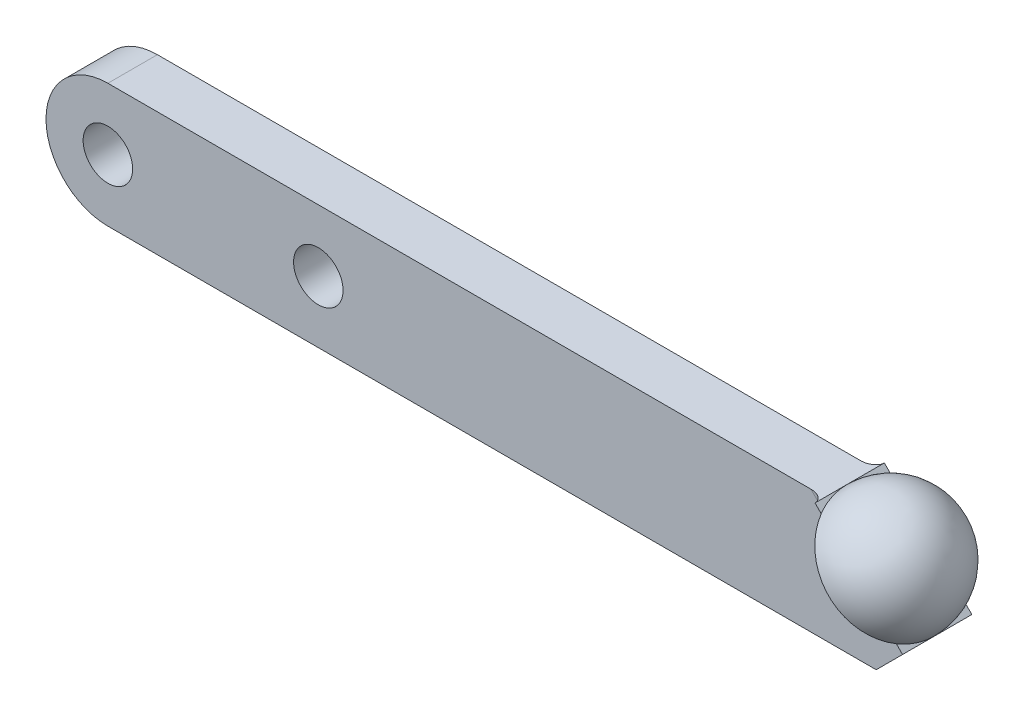
ISO-10303-21;
HEADER;
FILE_DESCRIPTION(('STEP AP214'),'2;1');
FILE_NAME('part.step','',(''),(''),'','','');
FILE_SCHEMA(('AUTOMOTIVE_DESIGN { 1 0 10303 214 1 1 1 1 }'));
ENDSEC;
DATA;
#1=APPLICATION_CONTEXT('core data for automotive mechanical design processes');
#2=APPLICATION_PROTOCOL_DEFINITION('international standard','automotive_design',2000,#1);
#3=PRODUCT_CONTEXT('',#1,'mechanical');
#4=PRODUCT('Part','Part','',(#3));
#5=PRODUCT_RELATED_PRODUCT_CATEGORY('part','',(#4));
#6=PRODUCT_DEFINITION_FORMATION('','',#4);
#7=PRODUCT_DEFINITION_CONTEXT('part definition',#1,'design');
#8=PRODUCT_DEFINITION('design','',#6,#7);
#9=PRODUCT_DEFINITION_SHAPE('','',#8);
#10=(LENGTH_UNIT() NAMED_UNIT(*) SI_UNIT(.MILLI.,.METRE.));
#11=(NAMED_UNIT(*) PLANE_ANGLE_UNIT() SI_UNIT($,.RADIAN.));
#12=(NAMED_UNIT(*) SI_UNIT($,.STERADIAN.) SOLID_ANGLE_UNIT());
#13=UNCERTAINTY_MEASURE_WITH_UNIT(LENGTH_MEASURE(1.E-05),#10,'distance_accuracy_value','');
#14=(GEOMETRIC_REPRESENTATION_CONTEXT(3) GLOBAL_UNCERTAINTY_ASSIGNED_CONTEXT((#13)) GLOBAL_UNIT_ASSIGNED_CONTEXT((#10,
#11,#12)) REPRESENTATION_CONTEXT('',''));
#15=CARTESIAN_POINT('',(0.,0.,0.));
#16=DIRECTION('',(0.,0.,1.));
#17=DIRECTION('',(1.,0.,0.));
#18=AXIS2_PLACEMENT_3D('',#15,#16,#17);
#19=CARTESIAN_POINT('',(-42.7007960781066,-30.845635416035,-2.54));
#20=DIRECTION('',(-0.707106781186547,0.707106781186548,0.));
#21=DIRECTION('',(-0.707106781186548,-0.707106781186547,0.));
#22=AXIS2_PLACEMENT_3D('',#19,#20,#21);
#23=CYLINDRICAL_SURFACE('',#22,2.54);
#24=CARTESIAN_POINT('',(-31.4754759267702,-42.0709555673715,-2.54));
#25=DIRECTION('',(-0.707106781186545,0.70710678118655,0.));
#26=DIRECTION('',(-0.70710678118655,-0.707106781186545,0.));
#27=AXIS2_PLACEMENT_3D('',#24,#25,#26);
#28=CIRCLE('',#27,2.54);
#29=CARTESIAN_POINT('',(-31.4754759267702,-42.0709555673715,0.));
#30=VERTEX_POINT('',#29);
#31=CARTESIAN_POINT('',(-29.6794247025575,-40.2749043431587,-2.5399971986685));
#32=VERTEX_POINT('',#31);
#33=EDGE_CURVE('E161',#30,#32,#28,.T.);
#34=ORIENTED_EDGE('',*,*,#33,.F.);
#35=DIRECTION('',(-0.707106781186547,0.707106781186548,0.));
#36=VECTOR('',#35,1.);
#37=CARTESIAN_POINT('',(-137.950796078106,64.404364583965,0.));
#38=LINE('',#37,#36);
#39=CARTESIAN_POINT('',(-55.7221674536569,-17.8242640404847,0.));
#40=VERTEX_POINT('',#39);
#41=EDGE_CURVE('E311',#40,#30,#38,.F.);
#42=ORIENTED_EDGE('',*,*,#41,.F.);
#43=CARTESIAN_POINT('',(-55.7221674536569,-17.8242640404847,-2.54));
#44=DIRECTION('',(0.,-1.,0.));
#45=DIRECTION('',(-1.,0.,0.));
#46=AXIS2_PLACEMENT_3D('',#43,#44,#45);
#47=ELLIPSE('',#46,3.59210244842766,2.54);
#48=CARTESIAN_POINT('',(-52.1300650052312,-17.8242640404847,-2.5399972094691));
#49=VERTEX_POINT('',#48);
#50=EDGE_CURVE('E301',#49,#40,#47,.T.);
#51=ORIENTED_EDGE('',*,*,#50,.F.);
#52=CARTESIAN_POINT('',(-52.1300650052292,-17.8242640404847,-2.53999818192678));
#53=CARTESIAN_POINT('',(-49.8325753263285,-20.1217537193853,-2.54000000000002));
#54=B_SPLINE_CURVE_WITH_KNOTS('',1,(#52,#53),.UNSPECIFIED.,.F.,.F.,(2,2),(0.,1.),.UNSPECIFIED.);
#55=CARTESIAN_POINT('',(-49.8325753263285,-20.1217537193853,-2.54));
#56=VERTEX_POINT('',#55);
#57=EDGE_CURVE('E11',#49,#56,#54,.T.);
#58=ORIENTED_EDGE('',*,*,#57,.T.);
#59=DIRECTION('',(-0.707106781186547,0.707106781186548,0.));
#60=VECTOR('',#59,1.);
#61=CARTESIAN_POINT('',(-40.9047448538928,-29.0495841918212,-2.54000000000002));
#62=LINE('',#61,#60);
#63=CARTESIAN_POINT('',(-31.976914381457,-37.9774146642569,-2.54000000000001));
#64=VERTEX_POINT('',#63);
#65=EDGE_CURVE('E319',#64,#56,#62,.T.);
#66=ORIENTED_EDGE('',*,*,#65,.F.);
#67=CARTESIAN_POINT('',(-29.6794247025563,-40.2749043431576,-2.53999816751797));
#68=CARTESIAN_POINT('',(-31.976914381457,-37.9774146642569,-2.54000000000002));
#69=B_SPLINE_CURVE_WITH_KNOTS('',1,(#67,#68),.UNSPECIFIED.,.F.,.F.,(2,2),(0.,1.),.UNSPECIFIED.);
#70=EDGE_CURVE('E51',#64,#32,#69,.F.);
#71=ORIENTED_EDGE('',*,*,#70,.T.);
#72=EDGE_LOOP('',(#34,#42,#51,#58,#66,#71));
#73=FACE_BOUND('',#72,.T.);
#74=ADVANCED_FACE('F41',(#73),#23,.F.);
#75=CARTESIAN_POINT('',(-40.9047448538928,-29.0495841918211,7.08306142092496));
#76=DIRECTION('',(-0.707106781186548,-0.707106781186547,0.));
#77=DIRECTION('',(-0.707106781186547,0.707106781186549,0.));
#78=AXIS2_PLACEMENT_3D('',#75,#76,#77);
#79=PLANE('',#78);
#80=DIRECTION('',(0.707106781186547,-0.707106781186548,0.));
#81=VECTOR('',#80,1.);
#82=CARTESIAN_POINT('',(-136.154744853893,66.2004158081788,0.));
#83=LINE('',#82,#81);
#84=CARTESIAN_POINT('',(-31.976914381457,-37.977414664257,0.));
#85=VERTEX_POINT('',#84);
#86=CARTESIAN_POINT('',(-30.8587041933289,-39.095624852385,0.));
#87=VERTEX_POINT('',#86);
#88=EDGE_CURVE('E169',#85,#87,#83,.T.);
#89=ORIENTED_EDGE('',*,*,#88,.F.);
#90=DIRECTION('',(0.,0.,1.));
#91=VECTOR('',#90,1.);
#92=CARTESIAN_POINT('',(-31.976914381457,-37.9774146642569,12.7));
#93=LINE('',#92,#91);
#94=EDGE_CURVE('E315',#85,#64,#93,.F.);
#95=ORIENTED_EDGE('',*,*,#94,.T.);
#96=CARTESIAN_POINT('',(-40.9047448538928,-29.0495841918211,7.08306142092496));
#97=DIRECTION('',(-0.707106781186548,-0.707106781186547,0.));
#98=DIRECTION('',(-0.707106781186547,0.707106781186549,0.));
#99=AXIS2_PLACEMENT_3D('',#96,#97,#98);
#100=CIRCLE('',#99,15.875);
#101=EDGE_CURVE('E173',#64,#87,#100,.T.);
#102=ORIENTED_EDGE('',*,*,#101,.T.);
#103=EDGE_LOOP('',(#89,#95,#102));
#104=FACE_BOUND('',#103,.T.);
#105=ADVANCED_FACE('F350',(#104),#79,.T.);
#106=EDGE_CURVE('E346',#56,#64,#100,.T.);
#107=ORIENTED_EDGE('',*,*,#106,.T.);
#108=ORIENTED_EDGE('',*,*,#65,.T.);
#109=EDGE_LOOP('',(#107,#108));
#110=FACE_BOUND('',#109,.T.);
#111=ADVANCED_FACE('F355',(#110),#79,.T.);
#112=CARTESIAN_POINT('',(-42.7007960781065,-30.8456354160349,15.24));
#113=DIRECTION('',(-0.707106781186547,0.707106781186548,0.));
#114=DIRECTION('',(-0.707106781186548,-0.707106781186547,0.));
#115=AXIS2_PLACEMENT_3D('',#112,#113,#114);
#116=CYLINDRICAL_SURFACE('',#115,2.54);
#117=CARTESIAN_POINT('',(-55.7221674536568,-17.8242640404847,15.24));
#118=DIRECTION('',(0.,-1.,0.));
#119=DIRECTION('',(-1.,0.,0.));
#120=AXIS2_PLACEMENT_3D('',#117,#118,#119);
#121=ELLIPSE('',#120,3.59210244842766,2.54);
#122=CARTESIAN_POINT('',(-55.7221674536568,-17.8242640404847,12.7));
#123=VERTEX_POINT('',#122);
#124=CARTESIAN_POINT('',(-52.1300650052312,-17.8242640404847,15.2399971247407));
#125=VERTEX_POINT('',#124);
#126=EDGE_CURVE('E268',#123,#125,#121,.T.);
#127=ORIENTED_EDGE('',*,*,#126,.F.);
#128=DIRECTION('',(0.707106781186547,-0.707106781186548,0.));
#129=VECTOR('',#128,1.);
#130=CARTESIAN_POINT('',(-42.7007960781065,-30.8456354160349,12.7));
#131=LINE('',#130,#129);
#132=CARTESIAN_POINT('',(-31.4754759267701,-42.0709555673714,12.7));
#133=VERTEX_POINT('',#132);
#134=EDGE_CURVE('E264',#133,#123,#131,.F.);
#135=ORIENTED_EDGE('',*,*,#134,.F.);
#136=CARTESIAN_POINT('',(-31.4754759267701,-42.0709555673714,15.24));
#137=DIRECTION('',(-0.707106781186545,0.70710678118655,0.));
#138=DIRECTION('',(-0.70710678118655,-0.707106781186545,0.));
#139=AXIS2_PLACEMENT_3D('',#136,#137,#138);
#140=CIRCLE('',#139,2.54);
#141=CARTESIAN_POINT('',(-29.6794247025574,-40.2749043431587,15.2399971134748));
#142=VERTEX_POINT('',#141);
#143=EDGE_CURVE('E272',#142,#133,#140,.T.);
#144=ORIENTED_EDGE('',*,*,#143,.F.);
#145=CARTESIAN_POINT('',(-29.6794247025563,-40.2749043431576,15.2399980538583));
#146=CARTESIAN_POINT('',(-31.2745844705659,-38.679744575148,15.24));
#147=B_SPLINE_CURVE_WITH_KNOTS('',1,(#145,#146),.UNSPECIFIED.,.F.,.F.,(2,2),(0.,1.),.UNSPECIFIED.);
#148=CARTESIAN_POINT('',(-31.2745844705659,-38.679744575148,15.24));
#149=VERTEX_POINT('',#148);
#150=EDGE_CURVE('E152',#142,#149,#147,.T.);
#151=ORIENTED_EDGE('',*,*,#150,.T.);
#152=DIRECTION('',(0.707106781186547,-0.707106781186548,0.));
#153=VECTOR('',#152,1.);
#154=CARTESIAN_POINT('',(-40.9047448538927,-29.0495841918211,15.24));
#155=LINE('',#154,#153);
#156=CARTESIAN_POINT('',(-50.5349052372196,-19.4194238084942,15.24));
#157=VERTEX_POINT('',#156);
#158=EDGE_CURVE('E256',#157,#149,#155,.T.);
#159=ORIENTED_EDGE('',*,*,#158,.F.);
#160=CARTESIAN_POINT('',(-52.1300650052292,-17.8242640404847,15.2399980688544));
#161=CARTESIAN_POINT('',(-50.5349052372196,-19.4194238084942,15.24));
#162=B_SPLINE_CURVE_WITH_KNOTS('',1,(#160,#161),.UNSPECIFIED.,.F.,.F.,(2,2),(0.,1.),.UNSPECIFIED.);
#163=EDGE_CURVE('E275',#157,#125,#162,.F.);
#164=ORIENTED_EDGE('',*,*,#163,.T.);
#165=EDGE_LOOP('',(#127,#135,#144,#151,#159,#164));
#166=FACE_BOUND('',#165,.T.);
#167=ADVANCED_FACE('F331',(#166),#116,.F.);
#168=DIRECTION('',(0.707106781186547,-0.707106781186548,0.));
#169=VECTOR('',#168,1.);
#170=CARTESIAN_POINT('',(-136.154744853893,66.2004158081789,12.7));
#171=LINE('',#170,#169);
#172=CARTESIAN_POINT('',(-51.4039263933961,-18.5504026523177,12.7));
#173=VERTEX_POINT('',#172);
#174=CARTESIAN_POINT('',(-50.5349052372196,-19.4194238084942,12.7));
#175=VERTEX_POINT('',#174);
#176=EDGE_CURVE('E193',#173,#175,#171,.T.);
#177=ORIENTED_EDGE('',*,*,#176,.T.);
#178=DIRECTION('',(0.,0.,1.));
#179=VECTOR('',#178,1.);
#180=CARTESIAN_POINT('',(-50.5349052372196,-19.4194238084942,12.7));
#181=LINE('',#180,#179);
#182=EDGE_CURVE('E260',#175,#157,#181,.T.);
#183=ORIENTED_EDGE('',*,*,#182,.T.);
#184=EDGE_CURVE('E339',#157,#173,#100,.T.);
#185=ORIENTED_EDGE('',*,*,#184,.T.);
#186=EDGE_LOOP('',(#177,#183,#185));
#187=FACE_BOUND('',#186,.T.);
#188=ADVANCED_FACE('F365',(#187),#79,.T.);
#189=EDGE_CURVE('E183',#149,#157,#100,.T.);
#190=ORIENTED_EDGE('',*,*,#189,.T.);
#191=ORIENTED_EDGE('',*,*,#158,.T.);
#192=EDGE_LOOP('',(#190,#191));
#193=FACE_BOUND('',#192,.T.);
#194=ADVANCED_FACE('F336',(#193),#79,.T.);
#195=CARTESIAN_POINT('',(-29.6794247025563,-40.2749043431576,12.7));
#196=DIRECTION('',(-0.707106781186549,-0.707106781186546,0.));
#197=DIRECTION('',(0.707106781186546,-0.707106781186549,0.));
#198=AXIS2_PLACEMENT_3D('',#195,#196,#197);
#199=PLANE('',#198);
#200=CARTESIAN_POINT('',(-52.1300650052292,-17.8242640404847,7.08306142092507));
#201=VERTEX_POINT('',#200);
#202=CARTESIAN_POINT('',(-50.9507855144566,-19.0035435312572,0.));
#203=VERTEX_POINT('',#202);
#204=EDGE_CURVE('E185',#201,#203,#100,.T.);
#205=ORIENTED_EDGE('',*,*,#204,.T.);
#206=CARTESIAN_POINT('',(-49.8325753263285,-20.1217537193854,0.));
#207=VERTEX_POINT('',#206);
#208=EDGE_CURVE('E188',#203,#207,#83,.T.);
#209=ORIENTED_EDGE('',*,*,#208,.T.);
#210=DIRECTION('',(0.,0.,1.));
#211=VECTOR('',#210,1.);
#212=CARTESIAN_POINT('',(-49.8325753263285,-20.1217537193853,12.7));
#213=LINE('',#212,#211);
#214=EDGE_CURVE('E322',#56,#207,#213,.T.);
#215=ORIENTED_EDGE('',*,*,#214,.F.);
#216=ORIENTED_EDGE('',*,*,#57,.F.);
#217=DIRECTION('',(0.,0.,-1.));
#218=VECTOR('',#217,1.);
#219=CARTESIAN_POINT('',(-52.1300650052292,-17.8242640404847,12.7));
#220=LINE('',#219,#218);
#221=EDGE_CURVE('E58',#201,#49,#220,.T.);
#222=ORIENTED_EDGE('',*,*,#221,.F.);
#223=EDGE_LOOP('',(#205,#209,#215,#216,#222));
#224=FACE_BOUND('',#223,.T.);
#225=ADVANCED_FACE('F292',(#224),#199,.F.);
#226=EDGE_CURVE('E184',#173,#201,#100,.T.);
#227=ORIENTED_EDGE('',*,*,#226,.T.);
#228=EDGE_CURVE('E163',#125,#201,#220,.T.);
#229=ORIENTED_EDGE('',*,*,#228,.F.);
#230=ORIENTED_EDGE('',*,*,#163,.F.);
#231=ORIENTED_EDGE('',*,*,#182,.F.);
#232=ORIENTED_EDGE('',*,*,#176,.F.);
#233=EDGE_LOOP('',(#227,#229,#230,#231,#232));
#234=FACE_BOUND('',#233,.T.);
#235=ADVANCED_FACE('F366',(#234),#199,.F.);
#236=CARTESIAN_POINT('',(-29.6794247025563,-40.2749043431576,7.08306142092496));
#237=VERTEX_POINT('',#236);
#238=EDGE_CURVE('E166',#87,#237,#100,.T.);
#239=ORIENTED_EDGE('',*,*,#238,.T.);
#240=DIRECTION('',(0.,0.,-1.));
#241=VECTOR('',#240,1.);
#242=CARTESIAN_POINT('',(-29.6794247025563,-40.2749043431576,12.7));
#243=LINE('',#242,#241);
#244=EDGE_CURVE('E66',#237,#32,#243,.T.);
#245=ORIENTED_EDGE('',*,*,#244,.T.);
#246=ORIENTED_EDGE('',*,*,#70,.F.);
#247=ORIENTED_EDGE('',*,*,#94,.F.);
#248=ORIENTED_EDGE('',*,*,#88,.T.);
#249=EDGE_LOOP('',(#239,#245,#246,#247,#248));
#250=FACE_BOUND('',#249,.T.);
#251=ADVANCED_FACE('F167',(#250),#199,.F.);
#252=CARTESIAN_POINT('',(-236.054424702556,-33.6992640404847,12.7));
#253=DIRECTION('',(0.,0.,1.));
#254=DIRECTION('',(1.,0.,0.));
#255=AXIS2_PLACEMENT_3D('',#252,#253,#254);
#256=PLANE('',#255);
#257=CARTESIAN_POINT('',(-182.079424702556,-33.6992640404846,12.7));
#258=DIRECTION('',(0.,0.,1.));
#259=DIRECTION('',(1.,0.,0.));
#260=AXIS2_PLACEMENT_3D('',#257,#258,#259);
#261=CIRCLE('',#260,6.35);
#262=CARTESIAN_POINT('',(-175.729424702556,-33.6992640404846,12.7));
#263=VERTEX_POINT('',#262);
#264=EDGE_CURVE('E206',#263,#263,#261,.T.);
#265=ORIENTED_EDGE('',*,*,#264,.F.);
#266=EDGE_LOOP('',(#265));
#267=FACE_BOUND('',#266,.T.);
#268=DIRECTION('',(0.70710678118655,0.707106781186545,0.));
#269=VECTOR('',#268,1.);
#270=CARTESIAN_POINT('',(-38.9787843998835,-49.5742640404847,12.7));
#271=LINE('',#270,#269);
#272=CARTESIAN_POINT('',(-38.9787843998835,-49.5742640404847,12.7));
#273=VERTEX_POINT('',#272);
#274=EDGE_CURVE('E222',#273,#133,#271,.T.);
#275=ORIENTED_EDGE('',*,*,#274,.T.);
#276=ORIENTED_EDGE('',*,*,#134,.T.);
#277=DIRECTION('',(-1.,0.,0.));
#278=VECTOR('',#277,1.);
#279=CARTESIAN_POINT('',(-52.1300650052292,-17.8242640404847,12.7));
#280=LINE('',#279,#278);
#281=CARTESIAN_POINT('',(-236.054424702556,-17.8242640404847,12.7));
#282=VERTEX_POINT('',#281);
#283=EDGE_CURVE('E226',#123,#282,#280,.T.);
#284=ORIENTED_EDGE('',*,*,#283,.T.);
#285=CARTESIAN_POINT('',(-236.054424702556,-33.6992640404847,12.7));
#286=DIRECTION('',(0.,0.,1.));
#287=DIRECTION('',(1.,0.,0.));
#288=AXIS2_PLACEMENT_3D('',#285,#286,#287);
#289=CIRCLE('',#288,15.875);
#290=CARTESIAN_POINT('',(-236.054424702556,-49.5742640404847,12.7));
#291=VERTEX_POINT('',#290);
#292=EDGE_CURVE('E214',#282,#291,#289,.T.);
#293=ORIENTED_EDGE('',*,*,#292,.T.);
#294=DIRECTION('',(1.,0.,0.));
#295=VECTOR('',#294,1.);
#296=CARTESIAN_POINT('',(-236.054424702556,-49.5742640404847,12.7));
#297=LINE('',#296,#295);
#298=EDGE_CURVE('E218',#291,#273,#297,.T.);
#299=ORIENTED_EDGE('',*,*,#298,.T.);
#300=EDGE_LOOP('',(#275,#276,#284,#293,#299));
#301=FACE_BOUND('',#300,.T.);
#302=CARTESIAN_POINT('',(-236.054424702556,-33.6992640404847,12.7));
#303=DIRECTION('',(0.,0.,1.));
#304=DIRECTION('',(1.,0.,0.));
#305=AXIS2_PLACEMENT_3D('',#302,#303,#304);
#306=CIRCLE('',#305,6.35);
#307=CARTESIAN_POINT('',(-229.704424702556,-33.6992640404847,12.7));
#308=VERTEX_POINT('',#307);
#309=EDGE_CURVE('E198',#308,#308,#306,.T.);
#310=ORIENTED_EDGE('',*,*,#309,.F.);
#311=EDGE_LOOP('',(#310));
#312=FACE_BOUND('',#311,.T.);
#313=ADVANCED_FACE('F371',(#267,#301,#312),#256,.T.);
#314=CARTESIAN_POINT('',(-236.054424702556,-33.6992640404847,0.));
#315=DIRECTION('',(0.,0.,1.));
#316=DIRECTION('',(1.,0.,0.));
#317=AXIS2_PLACEMENT_3D('',#314,#315,#316);
#318=PLANE('',#317);
#319=DIRECTION('',(-1.,0.,0.));
#320=VECTOR('',#319,1.);
#321=CARTESIAN_POINT('',(-236.054424702556,-17.8242640404847,0.));
#322=LINE('',#321,#320);
#323=CARTESIAN_POINT('',(-236.054424702556,-17.8242640404847,0.));
#324=VERTEX_POINT('',#323);
#325=EDGE_CURVE('E219',#40,#324,#322,.T.);
#326=ORIENTED_EDGE('',*,*,#325,.F.);
#327=ORIENTED_EDGE('',*,*,#41,.T.);
#328=DIRECTION('',(0.70710678118655,0.707106781186545,0.));
#329=VECTOR('',#328,1.);
#330=CARTESIAN_POINT('',(-38.9787843998835,-49.5742640404847,0.));
#331=LINE('',#330,#329);
#332=CARTESIAN_POINT('',(-38.9787843998835,-49.5742640404847,0.));
#333=VERTEX_POINT('',#332);
#334=EDGE_CURVE('E236',#333,#30,#331,.T.);
#335=ORIENTED_EDGE('',*,*,#334,.F.);
#336=DIRECTION('',(1.,0.,0.));
#337=VECTOR('',#336,1.);
#338=CARTESIAN_POINT('',(-236.054424702556,-49.5742640404847,0.));
#339=LINE('',#338,#337);
#340=CARTESIAN_POINT('',(-236.054424702556,-49.5742640404847,0.));
#341=VERTEX_POINT('',#340);
#342=EDGE_CURVE('E233',#341,#333,#339,.T.);
#343=ORIENTED_EDGE('',*,*,#342,.F.);
#344=CARTESIAN_POINT('',(-236.054424702556,-33.6992640404847,0.));
#345=DIRECTION('',(0.,0.,1.));
#346=DIRECTION('',(1.,0.,0.));
#347=AXIS2_PLACEMENT_3D('',#344,#345,#346);
#348=CIRCLE('',#347,15.875);
#349=EDGE_CURVE('E210',#324,#341,#348,.T.);
#350=ORIENTED_EDGE('',*,*,#349,.F.);
#351=EDGE_LOOP('',(#326,#327,#335,#343,#350));
#352=FACE_BOUND('',#351,.T.);
#353=CARTESIAN_POINT('',(-182.079424702556,-33.6992640404846,0.));
#354=DIRECTION('',(0.,0.,1.));
#355=DIRECTION('',(1.,0.,0.));
#356=AXIS2_PLACEMENT_3D('',#353,#354,#355);
#357=CIRCLE('',#356,6.35);
#358=CARTESIAN_POINT('',(-175.729424702556,-33.6992640404846,0.));
#359=VERTEX_POINT('',#358);
#360=EDGE_CURVE('E202',#359,#359,#357,.T.);
#361=ORIENTED_EDGE('',*,*,#360,.T.);
#362=EDGE_LOOP('',(#361));
#363=FACE_BOUND('',#362,.T.);
#364=CARTESIAN_POINT('',(-236.054424702556,-33.6992640404847,0.));
#365=DIRECTION('',(0.,0.,1.));
#366=DIRECTION('',(1.,0.,0.));
#367=AXIS2_PLACEMENT_3D('',#364,#365,#366);
#368=CIRCLE('',#367,6.35);
#369=CARTESIAN_POINT('',(-229.704424702556,-33.6992640404847,0.));
#370=VERTEX_POINT('',#369);
#371=EDGE_CURVE('E197',#370,#370,#368,.T.);
#372=ORIENTED_EDGE('',*,*,#371,.T.);
#373=EDGE_LOOP('',(#372));
#374=FACE_BOUND('',#373,.T.);
#375=ADVANCED_FACE('F380',(#352,#363,#374),#318,.F.);
#376=CARTESIAN_POINT('',(-236.054424702556,-33.6992640404847,12.7));
#377=DIRECTION('',(0.,0.,-1.));
#378=DIRECTION('',(-1.,0.,0.));
#379=AXIS2_PLACEMENT_3D('',#376,#377,#378);
#380=CYLINDRICAL_SURFACE('',#379,15.875);
#381=ORIENTED_EDGE('',*,*,#349,.T.);
#382=DIRECTION('',(0.,0.,-1.));
#383=VECTOR('',#382,1.);
#384=CARTESIAN_POINT('',(-236.054424702556,-49.5742640404847,12.7));
#385=LINE('',#384,#383);
#386=EDGE_CURVE('E249',#291,#341,#385,.T.);
#387=ORIENTED_EDGE('',*,*,#386,.F.);
#388=ORIENTED_EDGE('',*,*,#292,.F.);
#389=DIRECTION('',(0.,0.,-1.));
#390=VECTOR('',#389,1.);
#391=CARTESIAN_POINT('',(-236.054424702556,-17.8242640404847,12.7));
#392=LINE('',#391,#390);
#393=EDGE_CURVE('E229',#282,#324,#392,.T.);
#394=ORIENTED_EDGE('',*,*,#393,.T.);
#395=EDGE_LOOP('',(#381,#387,#388,#394));
#396=FACE_BOUND('',#395,.T.);
#397=ADVANCED_FACE('F385',(#396),#380,.T.);
#398=CARTESIAN_POINT('',(-236.054424702556,-49.5742640404847,12.7));
#399=DIRECTION('',(0.,1.,0.));
#400=DIRECTION('',(0.,0.,1.));
#401=AXIS2_PLACEMENT_3D('',#398,#399,#400);
#402=PLANE('',#401);
#403=ORIENTED_EDGE('',*,*,#342,.T.);
#404=DIRECTION('',(0.,0.,-1.));
#405=VECTOR('',#404,1.);
#406=CARTESIAN_POINT('',(-38.9787843998835,-49.5742640404847,12.7));
#407=LINE('',#406,#405);
#408=EDGE_CURVE('E156',#273,#333,#407,.T.);
#409=ORIENTED_EDGE('',*,*,#408,.F.);
#410=ORIENTED_EDGE('',*,*,#298,.F.);
#411=ORIENTED_EDGE('',*,*,#386,.T.);
#412=EDGE_LOOP('',(#403,#409,#410,#411));
#413=FACE_BOUND('',#412,.T.);
#414=ADVANCED_FACE('F386',(#413),#402,.F.);
#415=CARTESIAN_POINT('',(-38.9787843998835,-49.5742640404847,12.7));
#416=DIRECTION('',(-0.707106781186545,0.70710678118655,0.));
#417=DIRECTION('',(-0.70710678118655,-0.707106781186545,0.));
#418=AXIS2_PLACEMENT_3D('',#415,#416,#417);
#419=PLANE('',#418);
#420=ORIENTED_EDGE('',*,*,#334,.T.);
#421=ORIENTED_EDGE('',*,*,#33,.T.);
#422=ORIENTED_EDGE('',*,*,#244,.F.);
#423=EDGE_CURVE('E145',#142,#237,#243,.T.);
#424=ORIENTED_EDGE('',*,*,#423,.F.);
#425=ORIENTED_EDGE('',*,*,#143,.T.);
#426=ORIENTED_EDGE('',*,*,#274,.F.);
#427=ORIENTED_EDGE('',*,*,#408,.T.);
#428=EDGE_LOOP('',(#420,#421,#422,#424,#425,#426,#427));
#429=FACE_BOUND('',#428,.T.);
#430=ADVANCED_FACE('F160',(#429),#419,.F.);
#431=CARTESIAN_POINT('',(-30.4055633143893,-39.5487657313246,12.7));
#432=VERTEX_POINT('',#431);
#433=EDGE_CURVE('E149',#237,#432,#100,.T.);
#434=ORIENTED_EDGE('',*,*,#433,.T.);
#435=CARTESIAN_POINT('',(-31.2745844705658,-38.6797445751481,12.7));
#436=VERTEX_POINT('',#435);
#437=EDGE_CURVE('E192',#436,#432,#171,.T.);
#438=ORIENTED_EDGE('',*,*,#437,.F.);
#439=DIRECTION('',(0.,0.,1.));
#440=VECTOR('',#439,1.);
#441=CARTESIAN_POINT('',(-31.2745844705659,-38.679744575148,12.7));
#442=LINE('',#441,#440);
#443=EDGE_CURVE('E253',#149,#436,#442,.F.);
#444=ORIENTED_EDGE('',*,*,#443,.F.);
#445=ORIENTED_EDGE('',*,*,#150,.F.);
#446=ORIENTED_EDGE('',*,*,#423,.T.);
#447=EDGE_LOOP('',(#434,#438,#444,#445,#446));
#448=FACE_BOUND('',#447,.T.);
#449=ADVANCED_FACE('F146',(#448),#199,.F.);
#450=CARTESIAN_POINT('',(-236.054424702556,-17.8242640404847,12.7));
#451=DIRECTION('',(0.,-1.,0.));
#452=DIRECTION('',(1.,0.,0.));
#453=AXIS2_PLACEMENT_3D('',#450,#451,#452);
#454=PLANE('',#453);
#455=ORIENTED_EDGE('',*,*,#221,.T.);
#456=ORIENTED_EDGE('',*,*,#50,.T.);
#457=ORIENTED_EDGE('',*,*,#325,.T.);
#458=ORIENTED_EDGE('',*,*,#393,.F.);
#459=ORIENTED_EDGE('',*,*,#283,.F.);
#460=ORIENTED_EDGE('',*,*,#126,.T.);
#461=ORIENTED_EDGE('',*,*,#228,.T.);
#462=EDGE_LOOP('',(#455,#456,#457,#458,#459,#460,#461));
#463=FACE_BOUND('',#462,.T.);
#464=ADVANCED_FACE('F291',(#463),#454,.F.);
#465=CARTESIAN_POINT('',(-182.079424702556,-33.6992640404846,12.7));
#466=DIRECTION('',(0.,0.,-1.));
#467=DIRECTION('',(-1.,0.,0.));
#468=AXIS2_PLACEMENT_3D('',#465,#466,#467);
#469=CYLINDRICAL_SURFACE('',#468,6.35);
#470=ORIENTED_EDGE('',*,*,#264,.T.);
#471=EDGE_LOOP('',(#470));
#472=FACE_BOUND('',#471,.T.);
#473=ORIENTED_EDGE('',*,*,#360,.F.);
#474=EDGE_LOOP('',(#473));
#475=FACE_BOUND('',#474,.T.);
#476=ADVANCED_FACE('F411',(#472,#475),#469,.F.);
#477=CARTESIAN_POINT('',(-236.054424702556,-33.6992640404847,12.7));
#478=DIRECTION('',(0.,0.,-1.));
#479=DIRECTION('',(-1.,0.,0.));
#480=AXIS2_PLACEMENT_3D('',#477,#478,#479);
#481=CYLINDRICAL_SURFACE('',#480,6.35);
#482=ORIENTED_EDGE('',*,*,#309,.T.);
#483=EDGE_LOOP('',(#482));
#484=FACE_BOUND('',#483,.T.);
#485=ORIENTED_EDGE('',*,*,#371,.F.);
#486=EDGE_LOOP('',(#485));
#487=FACE_BOUND('',#486,.T.);
#488=ADVANCED_FACE('F407',(#484,#487),#481,.F.);
#489=EDGE_CURVE('E175',#203,#56,#100,.T.);
#490=ORIENTED_EDGE('',*,*,#489,.T.);
#491=ORIENTED_EDGE('',*,*,#214,.T.);
#492=ORIENTED_EDGE('',*,*,#208,.F.);
#493=EDGE_LOOP('',(#490,#491,#492));
#494=FACE_BOUND('',#493,.T.);
#495=ADVANCED_FACE('F359',(#494),#79,.T.);
#496=CARTESIAN_POINT('',(-40.9047448538928,-29.0495841918211,7.08306142092496));
#497=DIRECTION('',(0.707106781186547,-0.707106781186549,0.));
#498=DIRECTION('',(0.,0.,1.));
#499=AXIS2_PLACEMENT_3D('',#496,#497,#498);
#500=SPHERICAL_SURFACE('',#499,15.875);
#501=CARTESIAN_POINT('',(-40.9047448538928,-29.0495841918211,7.08306142092496));
#502=DIRECTION('',(-0.707106781186548,-0.707106781186547,0.));
#503=DIRECTION('',(-0.707106781186547,0.707106781186548,0.));
#504=AXIS2_PLACEMENT_3D('',#501,#502,#503);
#505=SPHERICAL_SURFACE('',#504,15.875);
#506=ORIENTED_EDGE('',*,*,#204,.F.);
#507=ORIENTED_EDGE('',*,*,#226,.F.);
#508=ORIENTED_EDGE('',*,*,#184,.F.);
#509=ORIENTED_EDGE('',*,*,#189,.F.);
#510=EDGE_CURVE('E180',#432,#149,#100,.T.);
#511=ORIENTED_EDGE('',*,*,#510,.F.);
#512=ORIENTED_EDGE('',*,*,#433,.F.);
#513=ORIENTED_EDGE('',*,*,#238,.F.);
#514=ORIENTED_EDGE('',*,*,#101,.F.);
#515=ORIENTED_EDGE('',*,*,#106,.F.);
#516=ORIENTED_EDGE('',*,*,#489,.F.);
#517=EDGE_LOOP('',(#506,#507,#508,#509,#511,#512,#513,#514,#515,#516));
#518=FACE_BOUND('',#517,.T.);
#519=ADVANCED_FACE('F177',(#518),#505,.T.);
#520=ORIENTED_EDGE('',*,*,#510,.T.);
#521=ORIENTED_EDGE('',*,*,#443,.T.);
#522=ORIENTED_EDGE('',*,*,#437,.T.);
#523=EDGE_LOOP('',(#520,#521,#522));
#524=FACE_BOUND('',#523,.T.);
#525=ADVANCED_FACE('F341',(#524),#79,.T.);
#526=CLOSED_SHELL('',(#74,#105,#111,#167,#188,#194,#225,#235,#251,#313,#375,#397,#414,#430,#449,
#464,#476,#488,#495,#519,#525));
#527=MANIFOLD_SOLID_BREP('B2',#526);
#528=ADVANCED_BREP_SHAPE_REPRESENTATION('',(#18,#527),#14);
#529=SHAPE_DEFINITION_REPRESENTATION(#9,#528);
ENDSEC;
END-ISO-10303-21;
